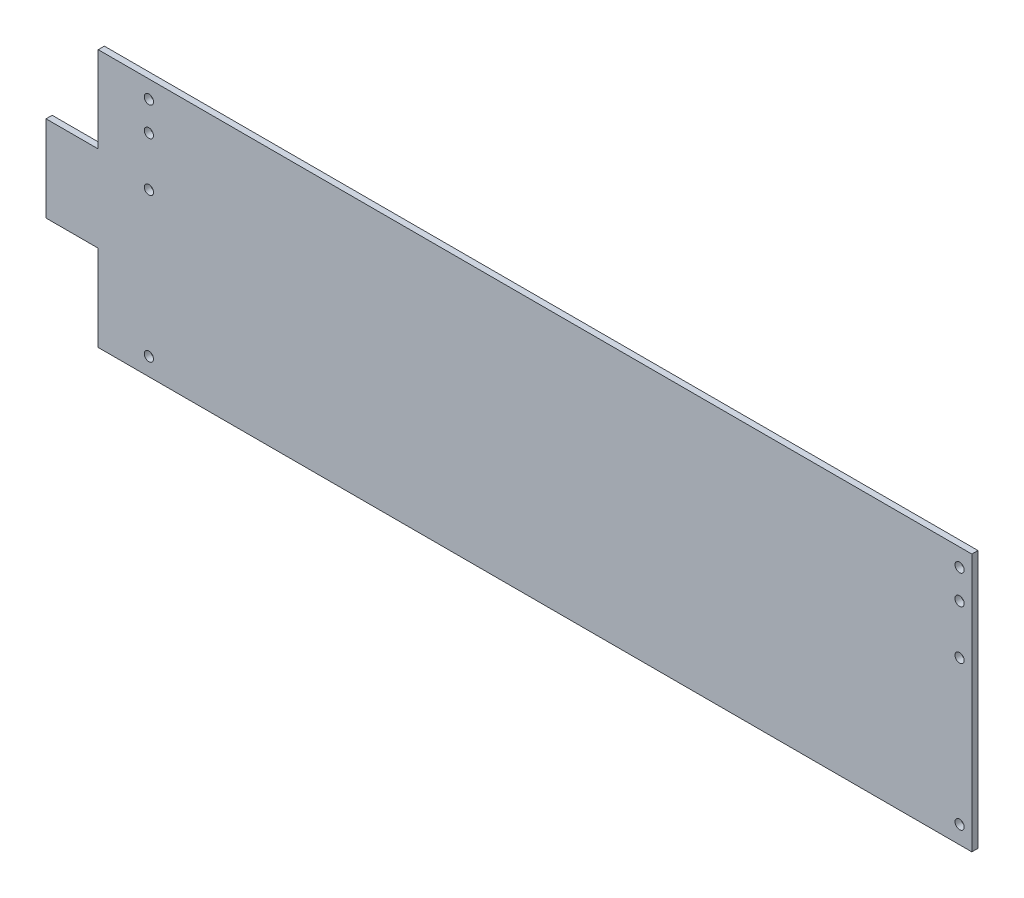
ISO-10303-21;
HEADER;
FILE_DESCRIPTION(('STEP AP214'),'2;1');
FILE_NAME('part.step','',(''),(''),'','','');
FILE_SCHEMA(('AUTOMOTIVE_DESIGN { 1 0 10303 214 1 1 1 1 }'));
ENDSEC;
DATA;
#1=APPLICATION_CONTEXT('core data for automotive mechanical design processes');
#2=APPLICATION_PROTOCOL_DEFINITION('international standard','automotive_design',2000,#1);
#3=PRODUCT_CONTEXT('',#1,'mechanical');
#4=PRODUCT('Part','Part','',(#3));
#5=PRODUCT_RELATED_PRODUCT_CATEGORY('part','',(#4));
#6=PRODUCT_DEFINITION_FORMATION('','',#4);
#7=PRODUCT_DEFINITION_CONTEXT('part definition',#1,'design');
#8=PRODUCT_DEFINITION('design','',#6,#7);
#9=PRODUCT_DEFINITION_SHAPE('','',#8);
#10=(LENGTH_UNIT() NAMED_UNIT(*) SI_UNIT(.MILLI.,.METRE.));
#11=(NAMED_UNIT(*) PLANE_ANGLE_UNIT() SI_UNIT($,.RADIAN.));
#12=(NAMED_UNIT(*) SI_UNIT($,.STERADIAN.) SOLID_ANGLE_UNIT());
#13=UNCERTAINTY_MEASURE_WITH_UNIT(LENGTH_MEASURE(1.E-05),#10,'distance_accuracy_value','');
#14=(GEOMETRIC_REPRESENTATION_CONTEXT(3) GLOBAL_UNCERTAINTY_ASSIGNED_CONTEXT((#13)) GLOBAL_UNIT_ASSIGNED_CONTEXT((#10,
#11,#12)) REPRESENTATION_CONTEXT('',''));
#15=CARTESIAN_POINT('',(0.,0.,0.));
#16=DIRECTION('',(0.,0.,1.));
#17=DIRECTION('',(1.,0.,0.));
#18=AXIS2_PLACEMENT_3D('',#15,#16,#17);
#19=CARTESIAN_POINT('',(0.,-42.,2.));
#20=DIRECTION('',(0.,1.,0.));
#21=DIRECTION('',(0.,0.,1.));
#22=AXIS2_PLACEMENT_3D('',#19,#20,#21);
#23=PLANE('',#22);
#24=DIRECTION('',(1.,0.,0.));
#25=VECTOR('',#24,1.);
#26=CARTESIAN_POINT('',(0.,-42.,0.));
#27=LINE('',#26,#25);
#28=CARTESIAN_POINT('',(-148.5,-42.,0.));
#29=VERTEX_POINT('',#28);
#30=CARTESIAN_POINT('',(136.,-42.,0.));
#31=VERTEX_POINT('',#30);
#32=EDGE_CURVE('E159',#29,#31,#27,.T.);
#33=ORIENTED_EDGE('',*,*,#32,.T.);
#34=DIRECTION('',(0.,0.,-1.));
#35=VECTOR('',#34,1.);
#36=CARTESIAN_POINT('',(136.,-42.,2.));
#37=LINE('',#36,#35);
#38=CARTESIAN_POINT('',(136.,-42.,2.));
#39=VERTEX_POINT('',#38);
#40=EDGE_CURVE('E11',#39,#31,#37,.T.);
#41=ORIENTED_EDGE('',*,*,#40,.F.);
#42=DIRECTION('',(1.,0.,0.));
#43=VECTOR('',#42,1.);
#44=CARTESIAN_POINT('',(0.,-42.,2.));
#45=LINE('',#44,#43);
#46=CARTESIAN_POINT('',(-148.5,-42.,2.));
#47=VERTEX_POINT('',#46);
#48=EDGE_CURVE('E212',#47,#39,#45,.T.);
#49=ORIENTED_EDGE('',*,*,#48,.F.);
#50=DIRECTION('',(0.,0.,-1.));
#51=VECTOR('',#50,1.);
#52=CARTESIAN_POINT('',(-148.5,-42.,2.));
#53=LINE('',#52,#51);
#54=EDGE_CURVE('E140',#47,#29,#53,.T.);
#55=ORIENTED_EDGE('',*,*,#54,.T.);
#56=EDGE_LOOP('',(#33,#41,#49,#55));
#57=FACE_BOUND('',#56,.T.);
#58=ADVANCED_FACE('F37',(#57),#23,.F.);
#59=CARTESIAN_POINT('',(136.,0.,2.));
#60=DIRECTION('',(-1.,0.,0.));
#61=DIRECTION('',(0.,0.,1.));
#62=AXIS2_PLACEMENT_3D('',#59,#60,#61);
#63=PLANE('',#62);
#64=DIRECTION('',(0.,1.,0.));
#65=VECTOR('',#64,1.);
#66=CARTESIAN_POINT('',(136.,0.,0.));
#67=LINE('',#66,#65);
#68=CARTESIAN_POINT('',(136.,42.,0.));
#69=VERTEX_POINT('',#68);
#70=EDGE_CURVE('E162',#31,#69,#67,.T.);
#71=ORIENTED_EDGE('',*,*,#70,.T.);
#72=DIRECTION('',(0.,0.,-1.));
#73=VECTOR('',#72,1.);
#74=CARTESIAN_POINT('',(136.,42.,2.));
#75=LINE('',#74,#73);
#76=CARTESIAN_POINT('',(136.,42.,2.));
#77=VERTEX_POINT('',#76);
#78=EDGE_CURVE('E46',#77,#69,#75,.T.);
#79=ORIENTED_EDGE('',*,*,#78,.F.);
#80=DIRECTION('',(0.,1.,0.));
#81=VECTOR('',#80,1.);
#82=CARTESIAN_POINT('',(136.,0.,2.));
#83=LINE('',#82,#81);
#84=EDGE_CURVE('E93',#39,#77,#83,.T.);
#85=ORIENTED_EDGE('',*,*,#84,.F.);
#86=ORIENTED_EDGE('',*,*,#40,.T.);
#87=EDGE_LOOP('',(#71,#79,#85,#86));
#88=FACE_BOUND('',#87,.T.);
#89=ADVANCED_FACE('F195',(#88),#63,.F.);
#90=CARTESIAN_POINT('',(0.,42.,2.));
#91=DIRECTION('',(0.,1.,0.));
#92=DIRECTION('',(0.,0.,1.));
#93=AXIS2_PLACEMENT_3D('',#90,#91,#92);
#94=PLANE('',#93);
#95=DIRECTION('',(1.,0.,0.));
#96=VECTOR('',#95,1.);
#97=CARTESIAN_POINT('',(0.,42.,0.));
#98=LINE('',#97,#96);
#99=CARTESIAN_POINT('',(-148.5,42.,0.));
#100=VERTEX_POINT('',#99);
#101=EDGE_CURVE('E165',#100,#69,#98,.T.);
#102=ORIENTED_EDGE('',*,*,#101,.F.);
#103=DIRECTION('',(0.,0.,-1.));
#104=VECTOR('',#103,1.);
#105=CARTESIAN_POINT('',(-148.5,42.,2.));
#106=LINE('',#105,#104);
#107=CARTESIAN_POINT('',(-148.5,42.,2.));
#108=VERTEX_POINT('',#107);
#109=EDGE_CURVE('E188',#108,#100,#106,.T.);
#110=ORIENTED_EDGE('',*,*,#109,.F.);
#111=DIRECTION('',(1.,0.,0.));
#112=VECTOR('',#111,1.);
#113=CARTESIAN_POINT('',(0.,42.,2.));
#114=LINE('',#113,#112);
#115=EDGE_CURVE('E194',#108,#77,#114,.T.);
#116=ORIENTED_EDGE('',*,*,#115,.T.);
#117=ORIENTED_EDGE('',*,*,#78,.T.);
#118=EDGE_LOOP('',(#102,#110,#116,#117));
#119=FACE_BOUND('',#118,.T.);
#120=ADVANCED_FACE('F192',(#119),#94,.T.);
#121=CARTESIAN_POINT('',(-148.5,0.,2.));
#122=DIRECTION('',(1.,0.,0.));
#123=DIRECTION('',(0.,0.,-1.));
#124=AXIS2_PLACEMENT_3D('',#121,#122,#123);
#125=PLANE('',#124);
#126=DIRECTION('',(0.,-1.,0.));
#127=VECTOR('',#126,1.);
#128=CARTESIAN_POINT('',(-148.5,0.,0.));
#129=LINE('',#128,#127);
#130=CARTESIAN_POINT('',(-148.5,14.,0.));
#131=VERTEX_POINT('',#130);
#132=EDGE_CURVE('E168',#100,#131,#129,.T.);
#133=ORIENTED_EDGE('',*,*,#132,.T.);
#134=DIRECTION('',(0.,0.,-1.));
#135=VECTOR('',#134,1.);
#136=CARTESIAN_POINT('',(-148.5,14.,2.));
#137=LINE('',#136,#135);
#138=CARTESIAN_POINT('',(-148.5,14.,2.));
#139=VERTEX_POINT('',#138);
#140=EDGE_CURVE('E185',#139,#131,#137,.T.);
#141=ORIENTED_EDGE('',*,*,#140,.F.);
#142=DIRECTION('',(0.,-1.,0.));
#143=VECTOR('',#142,1.);
#144=CARTESIAN_POINT('',(-148.5,0.,2.));
#145=LINE('',#144,#143);
#146=EDGE_CURVE('E132',#108,#139,#145,.T.);
#147=ORIENTED_EDGE('',*,*,#146,.F.);
#148=ORIENTED_EDGE('',*,*,#109,.T.);
#149=EDGE_LOOP('',(#133,#141,#147,#148));
#150=FACE_BOUND('',#149,.T.);
#151=ADVANCED_FACE('F205',(#150),#125,.F.);
#152=CARTESIAN_POINT('',(0.,14.,2.));
#153=DIRECTION('',(0.,-1.,0.));
#154=DIRECTION('',(1.,0.,0.));
#155=AXIS2_PLACEMENT_3D('',#152,#153,#154);
#156=PLANE('',#155);
#157=DIRECTION('',(-1.,0.,0.));
#158=VECTOR('',#157,1.);
#159=CARTESIAN_POINT('',(0.,14.,0.));
#160=LINE('',#159,#158);
#161=CARTESIAN_POINT('',(-165.5,14.,0.));
#162=VERTEX_POINT('',#161);
#163=EDGE_CURVE('E170',#131,#162,#160,.T.);
#164=ORIENTED_EDGE('',*,*,#163,.T.);
#165=DIRECTION('',(0.,0.,-1.));
#166=VECTOR('',#165,1.);
#167=CARTESIAN_POINT('',(-165.5,14.,2.));
#168=LINE('',#167,#166);
#169=CARTESIAN_POINT('',(-165.5,14.,2.));
#170=VERTEX_POINT('',#169);
#171=EDGE_CURVE('E126',#170,#162,#168,.T.);
#172=ORIENTED_EDGE('',*,*,#171,.F.);
#173=DIRECTION('',(-1.,0.,0.));
#174=VECTOR('',#173,1.);
#175=CARTESIAN_POINT('',(0.,14.,2.));
#176=LINE('',#175,#174);
#177=EDGE_CURVE('E113',#139,#170,#176,.T.);
#178=ORIENTED_EDGE('',*,*,#177,.F.);
#179=ORIENTED_EDGE('',*,*,#140,.T.);
#180=EDGE_LOOP('',(#164,#172,#178,#179));
#181=FACE_BOUND('',#180,.T.);
#182=ADVANCED_FACE('F208',(#181),#156,.F.);
#183=CARTESIAN_POINT('',(-165.5,0.,2.));
#184=DIRECTION('',(1.,0.,0.));
#185=DIRECTION('',(0.,0.,-1.));
#186=AXIS2_PLACEMENT_3D('',#183,#184,#185);
#187=PLANE('',#186);
#188=DIRECTION('',(0.,-1.,0.));
#189=VECTOR('',#188,1.);
#190=CARTESIAN_POINT('',(-165.5,0.,0.));
#191=LINE('',#190,#189);
#192=CARTESIAN_POINT('',(-165.5,-14.,0.));
#193=VERTEX_POINT('',#192);
#194=EDGE_CURVE('E122',#162,#193,#191,.T.);
#195=ORIENTED_EDGE('',*,*,#194,.T.);
#196=DIRECTION('',(0.,0.,-1.));
#197=VECTOR('',#196,1.);
#198=CARTESIAN_POINT('',(-165.5,-14.,2.));
#199=LINE('',#198,#197);
#200=CARTESIAN_POINT('',(-165.5,-14.,2.));
#201=VERTEX_POINT('',#200);
#202=EDGE_CURVE('E119',#201,#193,#199,.T.);
#203=ORIENTED_EDGE('',*,*,#202,.F.);
#204=DIRECTION('',(0.,-1.,0.));
#205=VECTOR('',#204,1.);
#206=CARTESIAN_POINT('',(-165.5,0.,2.));
#207=LINE('',#206,#205);
#208=EDGE_CURVE('E106',#170,#201,#207,.T.);
#209=ORIENTED_EDGE('',*,*,#208,.F.);
#210=ORIENTED_EDGE('',*,*,#171,.T.);
#211=EDGE_LOOP('',(#195,#203,#209,#210));
#212=FACE_BOUND('',#211,.T.);
#213=ADVANCED_FACE('F120',(#212),#187,.F.);
#214=CARTESIAN_POINT('',(0.,-14.,2.));
#215=DIRECTION('',(0.,-1.,0.));
#216=DIRECTION('',(1.,0.,0.));
#217=AXIS2_PLACEMENT_3D('',#214,#215,#216);
#218=PLANE('',#217);
#219=DIRECTION('',(-1.,0.,0.));
#220=VECTOR('',#219,1.);
#221=CARTESIAN_POINT('',(0.,-14.,0.));
#222=LINE('',#221,#220);
#223=CARTESIAN_POINT('',(-148.5,-14.,0.));
#224=VERTEX_POINT('',#223);
#225=EDGE_CURVE('E173',#224,#193,#222,.T.);
#226=ORIENTED_EDGE('',*,*,#225,.F.);
#227=DIRECTION('',(0.,0.,-1.));
#228=VECTOR('',#227,1.);
#229=CARTESIAN_POINT('',(-148.5,-14.,2.));
#230=LINE('',#229,#228);
#231=CARTESIAN_POINT('',(-148.5,-14.,2.));
#232=VERTEX_POINT('',#231);
#233=EDGE_CURVE('E82',#232,#224,#230,.T.);
#234=ORIENTED_EDGE('',*,*,#233,.F.);
#235=DIRECTION('',(-1.,0.,0.));
#236=VECTOR('',#235,1.);
#237=CARTESIAN_POINT('',(0.,-14.,2.));
#238=LINE('',#237,#236);
#239=EDGE_CURVE('E111',#232,#201,#238,.T.);
#240=ORIENTED_EDGE('',*,*,#239,.T.);
#241=ORIENTED_EDGE('',*,*,#202,.T.);
#242=EDGE_LOOP('',(#226,#234,#240,#241));
#243=FACE_BOUND('',#242,.T.);
#244=ADVANCED_FACE('F128',(#243),#218,.T.);
#245=CARTESIAN_POINT('',(-132.,10.75,2.));
#246=DIRECTION('',(0.,0.,-1.));
#247=DIRECTION('',(-1.,0.,0.));
#248=AXIS2_PLACEMENT_3D('',#245,#246,#247);
#249=CYLINDRICAL_SURFACE('',#248,1.5);
#250=CARTESIAN_POINT('',(-132.,10.75,2.));
#251=DIRECTION('',(0.,0.,1.));
#252=DIRECTION('',(1.,0.,0.));
#253=AXIS2_PLACEMENT_3D('',#250,#251,#252);
#254=CIRCLE('',#253,1.5);
#255=CARTESIAN_POINT('',(-130.5,10.75,2.));
#256=VERTEX_POINT('',#255);
#257=EDGE_CURVE('E130',#256,#256,#254,.F.);
#258=ORIENTED_EDGE('',*,*,#257,.F.);
#259=EDGE_LOOP('',(#258));
#260=FACE_BOUND('',#259,.T.);
#261=CARTESIAN_POINT('',(-132.,10.75,0.));
#262=DIRECTION('',(0.,0.,1.));
#263=DIRECTION('',(1.,0.,0.));
#264=AXIS2_PLACEMENT_3D('',#261,#262,#263);
#265=CIRCLE('',#264,1.5);
#266=CARTESIAN_POINT('',(-130.5,10.75,0.));
#267=VERTEX_POINT('',#266);
#268=EDGE_CURVE('E175',#267,#267,#265,.F.);
#269=ORIENTED_EDGE('',*,*,#268,.T.);
#270=EDGE_LOOP('',(#269));
#271=FACE_BOUND('',#270,.T.);
#272=ADVANCED_FACE('F266',(#260,#271),#249,.F.);
#273=EDGE_CURVE('E85',#224,#29,#129,.T.);
#274=ORIENTED_EDGE('',*,*,#273,.T.);
#275=ORIENTED_EDGE('',*,*,#54,.F.);
#276=EDGE_CURVE('E54',#232,#47,#145,.T.);
#277=ORIENTED_EDGE('',*,*,#276,.F.);
#278=ORIENTED_EDGE('',*,*,#233,.T.);
#279=EDGE_LOOP('',(#274,#275,#277,#278));
#280=FACE_BOUND('',#279,.T.);
#281=ADVANCED_FACE('F256',(#280),#125,.F.);
#282=CARTESIAN_POINT('',(132.,36.25,2.));
#283=DIRECTION('',(0.,0.,-1.));
#284=DIRECTION('',(-1.,0.,0.));
#285=AXIS2_PLACEMENT_3D('',#282,#283,#284);
#286=CYLINDRICAL_SURFACE('',#285,1.5);
#287=CARTESIAN_POINT('',(132.,36.25,2.));
#288=DIRECTION('',(0.,0.,1.));
#289=DIRECTION('',(1.,0.,0.));
#290=AXIS2_PLACEMENT_3D('',#287,#288,#289);
#291=CIRCLE('',#290,1.5);
#292=CARTESIAN_POINT('',(133.5,36.25,2.));
#293=VERTEX_POINT('',#292);
#294=EDGE_CURVE('E214',#293,#293,#291,.T.);
#295=ORIENTED_EDGE('',*,*,#294,.T.);
#296=EDGE_LOOP('',(#295));
#297=FACE_BOUND('',#296,.T.);
#298=CARTESIAN_POINT('',(132.,36.25,0.));
#299=DIRECTION('',(0.,0.,1.));
#300=DIRECTION('',(1.,0.,0.));
#301=AXIS2_PLACEMENT_3D('',#298,#299,#300);
#302=CIRCLE('',#301,1.5);
#303=CARTESIAN_POINT('',(133.5,36.25,0.));
#304=VERTEX_POINT('',#303);
#305=EDGE_CURVE('E156',#304,#304,#302,.T.);
#306=ORIENTED_EDGE('',*,*,#305,.F.);
#307=EDGE_LOOP('',(#306));
#308=FACE_BOUND('',#307,.T.);
#309=ADVANCED_FACE('F253',(#297,#308),#286,.F.);
#310=CARTESIAN_POINT('',(132.,26.75,2.));
#311=DIRECTION('',(0.,0.,-1.));
#312=DIRECTION('',(-1.,0.,0.));
#313=AXIS2_PLACEMENT_3D('',#310,#311,#312);
#314=CYLINDRICAL_SURFACE('',#313,1.5);
#315=CARTESIAN_POINT('',(132.,26.75,2.));
#316=DIRECTION('',(0.,0.,1.));
#317=DIRECTION('',(1.,0.,0.));
#318=AXIS2_PLACEMENT_3D('',#315,#316,#317);
#319=CIRCLE('',#318,1.5);
#320=CARTESIAN_POINT('',(133.5,26.75,2.));
#321=VERTEX_POINT('',#320);
#322=EDGE_CURVE('E217',#321,#321,#319,.T.);
#323=ORIENTED_EDGE('',*,*,#322,.T.);
#324=EDGE_LOOP('',(#323));
#325=FACE_BOUND('',#324,.T.);
#326=CARTESIAN_POINT('',(132.,26.75,0.));
#327=DIRECTION('',(0.,0.,1.));
#328=DIRECTION('',(1.,0.,0.));
#329=AXIS2_PLACEMENT_3D('',#326,#327,#328);
#330=CIRCLE('',#329,1.5);
#331=CARTESIAN_POINT('',(133.5,26.75,0.));
#332=VERTEX_POINT('',#331);
#333=EDGE_CURVE('E153',#332,#332,#330,.T.);
#334=ORIENTED_EDGE('',*,*,#333,.F.);
#335=EDGE_LOOP('',(#334));
#336=FACE_BOUND('',#335,.T.);
#337=ADVANCED_FACE('F255',(#325,#336),#314,.F.);
#338=CARTESIAN_POINT('',(132.,10.75,2.));
#339=DIRECTION('',(0.,0.,-1.));
#340=DIRECTION('',(-1.,0.,0.));
#341=AXIS2_PLACEMENT_3D('',#338,#339,#340);
#342=CYLINDRICAL_SURFACE('',#341,1.5);
#343=CARTESIAN_POINT('',(132.,10.75,2.));
#344=DIRECTION('',(0.,0.,1.));
#345=DIRECTION('',(1.,0.,0.));
#346=AXIS2_PLACEMENT_3D('',#343,#344,#345);
#347=CIRCLE('',#346,1.5);
#348=CARTESIAN_POINT('',(133.5,10.75,2.));
#349=VERTEX_POINT('',#348);
#350=EDGE_CURVE('E220',#349,#349,#347,.T.);
#351=ORIENTED_EDGE('',*,*,#350,.T.);
#352=EDGE_LOOP('',(#351));
#353=FACE_BOUND('',#352,.T.);
#354=CARTESIAN_POINT('',(132.,10.75,0.));
#355=DIRECTION('',(0.,0.,1.));
#356=DIRECTION('',(1.,0.,0.));
#357=AXIS2_PLACEMENT_3D('',#354,#355,#356);
#358=CIRCLE('',#357,1.5);
#359=CARTESIAN_POINT('',(133.5,10.75,0.));
#360=VERTEX_POINT('',#359);
#361=EDGE_CURVE('E150',#360,#360,#358,.T.);
#362=ORIENTED_EDGE('',*,*,#361,.F.);
#363=EDGE_LOOP('',(#362));
#364=FACE_BOUND('',#363,.T.);
#365=ADVANCED_FACE('F263',(#353,#364),#342,.F.);
#366=CARTESIAN_POINT('',(132.,-36.25,2.));
#367=DIRECTION('',(0.,0.,-1.));
#368=DIRECTION('',(-1.,0.,0.));
#369=AXIS2_PLACEMENT_3D('',#366,#367,#368);
#370=CYLINDRICAL_SURFACE('',#369,1.5);
#371=CARTESIAN_POINT('',(132.,-36.25,2.));
#372=DIRECTION('',(0.,0.,1.));
#373=DIRECTION('',(1.,0.,0.));
#374=AXIS2_PLACEMENT_3D('',#371,#372,#373);
#375=CIRCLE('',#374,1.5);
#376=CARTESIAN_POINT('',(133.5,-36.25,2.));
#377=VERTEX_POINT('',#376);
#378=EDGE_CURVE('E223',#377,#377,#375,.T.);
#379=ORIENTED_EDGE('',*,*,#378,.T.);
#380=EDGE_LOOP('',(#379));
#381=FACE_BOUND('',#380,.T.);
#382=CARTESIAN_POINT('',(132.,-36.25,0.));
#383=DIRECTION('',(0.,0.,1.));
#384=DIRECTION('',(1.,0.,0.));
#385=AXIS2_PLACEMENT_3D('',#382,#383,#384);
#386=CIRCLE('',#385,1.5);
#387=CARTESIAN_POINT('',(133.5,-36.25,0.));
#388=VERTEX_POINT('',#387);
#389=EDGE_CURVE('E147',#388,#388,#386,.T.);
#390=ORIENTED_EDGE('',*,*,#389,.F.);
#391=EDGE_LOOP('',(#390));
#392=FACE_BOUND('',#391,.T.);
#393=ADVANCED_FACE('F332',(#381,#392),#370,.F.);
#394=CARTESIAN_POINT('',(-132.,-36.25,2.));
#395=DIRECTION('',(0.,0.,-1.));
#396=DIRECTION('',(-1.,0.,0.));
#397=AXIS2_PLACEMENT_3D('',#394,#395,#396);
#398=CYLINDRICAL_SURFACE('',#397,1.5);
#399=CARTESIAN_POINT('',(-132.,-36.25,2.));
#400=DIRECTION('',(0.,0.,1.));
#401=DIRECTION('',(1.,0.,0.));
#402=AXIS2_PLACEMENT_3D('',#399,#400,#401);
#403=CIRCLE('',#402,1.5);
#404=CARTESIAN_POINT('',(-130.5,-36.25,2.));
#405=VERTEX_POINT('',#404);
#406=EDGE_CURVE('E226',#405,#405,#403,.F.);
#407=ORIENTED_EDGE('',*,*,#406,.F.);
#408=EDGE_LOOP('',(#407));
#409=FACE_BOUND('',#408,.T.);
#410=CARTESIAN_POINT('',(-132.,-36.25,0.));
#411=DIRECTION('',(0.,0.,1.));
#412=DIRECTION('',(1.,0.,0.));
#413=AXIS2_PLACEMENT_3D('',#410,#411,#412);
#414=CIRCLE('',#413,1.5);
#415=CARTESIAN_POINT('',(-130.5,-36.25,0.));
#416=VERTEX_POINT('',#415);
#417=EDGE_CURVE('E144',#416,#416,#414,.F.);
#418=ORIENTED_EDGE('',*,*,#417,.T.);
#419=EDGE_LOOP('',(#418));
#420=FACE_BOUND('',#419,.T.);
#421=ADVANCED_FACE('F237',(#409,#420),#398,.F.);
#422=CARTESIAN_POINT('',(-132.,26.75,2.));
#423=DIRECTION('',(0.,0.,-1.));
#424=DIRECTION('',(-1.,0.,0.));
#425=AXIS2_PLACEMENT_3D('',#422,#423,#424);
#426=CYLINDRICAL_SURFACE('',#425,1.5);
#427=CARTESIAN_POINT('',(-132.,26.75,2.));
#428=DIRECTION('',(0.,0.,1.));
#429=DIRECTION('',(1.,0.,0.));
#430=AXIS2_PLACEMENT_3D('',#427,#428,#429);
#431=CIRCLE('',#430,1.5);
#432=CARTESIAN_POINT('',(-130.5,26.75,2.));
#433=VERTEX_POINT('',#432);
#434=EDGE_CURVE('E181',#433,#433,#431,.F.);
#435=ORIENTED_EDGE('',*,*,#434,.F.);
#436=EDGE_LOOP('',(#435));
#437=FACE_BOUND('',#436,.T.);
#438=CARTESIAN_POINT('',(-132.,26.75,0.));
#439=DIRECTION('',(0.,0.,1.));
#440=DIRECTION('',(1.,0.,0.));
#441=AXIS2_PLACEMENT_3D('',#438,#439,#440);
#442=CIRCLE('',#441,1.5);
#443=CARTESIAN_POINT('',(-130.5,26.75,0.));
#444=VERTEX_POINT('',#443);
#445=EDGE_CURVE('E141',#444,#444,#442,.F.);
#446=ORIENTED_EDGE('',*,*,#445,.T.);
#447=EDGE_LOOP('',(#446));
#448=FACE_BOUND('',#447,.T.);
#449=ADVANCED_FACE('F39',(#437,#448),#426,.F.);
#450=CARTESIAN_POINT('',(-132.,36.25,2.));
#451=DIRECTION('',(0.,0.,-1.));
#452=DIRECTION('',(-1.,0.,0.));
#453=AXIS2_PLACEMENT_3D('',#450,#451,#452);
#454=CYLINDRICAL_SURFACE('',#453,1.5);
#455=CARTESIAN_POINT('',(-132.,36.25,2.));
#456=DIRECTION('',(0.,0.,1.));
#457=DIRECTION('',(1.,0.,0.));
#458=AXIS2_PLACEMENT_3D('',#455,#456,#457);
#459=CIRCLE('',#458,1.5);
#460=CARTESIAN_POINT('',(-130.5,36.25,2.));
#461=VERTEX_POINT('',#460);
#462=EDGE_CURVE('E137',#461,#461,#459,.F.);
#463=ORIENTED_EDGE('',*,*,#462,.F.);
#464=EDGE_LOOP('',(#463));
#465=FACE_BOUND('',#464,.T.);
#466=CARTESIAN_POINT('',(-132.,36.25,0.));
#467=DIRECTION('',(0.,0.,1.));
#468=DIRECTION('',(1.,0.,0.));
#469=AXIS2_PLACEMENT_3D('',#466,#467,#468);
#470=CIRCLE('',#469,1.5);
#471=CARTESIAN_POINT('',(-130.5,36.25,0.));
#472=VERTEX_POINT('',#471);
#473=EDGE_CURVE('E178',#472,#472,#470,.F.);
#474=ORIENTED_EDGE('',*,*,#473,.T.);
#475=EDGE_LOOP('',(#474));
#476=FACE_BOUND('',#475,.T.);
#477=ADVANCED_FACE('F236',(#465,#476),#454,.F.);
#478=CARTESIAN_POINT('',(0.,0.,2.));
#479=DIRECTION('',(0.,0.,1.));
#480=DIRECTION('',(1.,0.,0.));
#481=AXIS2_PLACEMENT_3D('',#478,#479,#480);
#482=PLANE('',#481);
#483=ORIENTED_EDGE('',*,*,#434,.T.);
#484=EDGE_LOOP('',(#483));
#485=FACE_BOUND('',#484,.T.);
#486=ORIENTED_EDGE('',*,*,#406,.T.);
#487=EDGE_LOOP('',(#486));
#488=FACE_BOUND('',#487,.T.);
#489=ORIENTED_EDGE('',*,*,#378,.F.);
#490=EDGE_LOOP('',(#489));
#491=FACE_BOUND('',#490,.T.);
#492=ORIENTED_EDGE('',*,*,#350,.F.);
#493=EDGE_LOOP('',(#492));
#494=FACE_BOUND('',#493,.T.);
#495=ORIENTED_EDGE('',*,*,#322,.F.);
#496=EDGE_LOOP('',(#495));
#497=FACE_BOUND('',#496,.T.);
#498=ORIENTED_EDGE('',*,*,#294,.F.);
#499=EDGE_LOOP('',(#498));
#500=FACE_BOUND('',#499,.T.);
#501=ORIENTED_EDGE('',*,*,#48,.T.);
#502=ORIENTED_EDGE('',*,*,#84,.T.);
#503=ORIENTED_EDGE('',*,*,#115,.F.);
#504=ORIENTED_EDGE('',*,*,#146,.T.);
#505=ORIENTED_EDGE('',*,*,#177,.T.);
#506=ORIENTED_EDGE('',*,*,#208,.T.);
#507=ORIENTED_EDGE('',*,*,#239,.F.);
#508=ORIENTED_EDGE('',*,*,#276,.T.);
#509=EDGE_LOOP('',(#501,#502,#503,#504,#505,#506,#507,#508));
#510=FACE_BOUND('',#509,.T.);
#511=ORIENTED_EDGE('',*,*,#257,.T.);
#512=EDGE_LOOP('',(#511));
#513=FACE_BOUND('',#512,.T.);
#514=ORIENTED_EDGE('',*,*,#462,.T.);
#515=EDGE_LOOP('',(#514));
#516=FACE_BOUND('',#515,.T.);
#517=ADVANCED_FACE('F108',(#485,#488,#491,#494,#497,#500,#510,#513,#516),#482,.T.);
#518=CARTESIAN_POINT('',(0.,0.,0.));
#519=DIRECTION('',(0.,0.,1.));
#520=DIRECTION('',(1.,0.,0.));
#521=AXIS2_PLACEMENT_3D('',#518,#519,#520);
#522=PLANE('',#521);
#523=ORIENTED_EDGE('',*,*,#445,.F.);
#524=EDGE_LOOP('',(#523));
#525=FACE_BOUND('',#524,.T.);
#526=ORIENTED_EDGE('',*,*,#417,.F.);
#527=EDGE_LOOP('',(#526));
#528=FACE_BOUND('',#527,.T.);
#529=ORIENTED_EDGE('',*,*,#389,.T.);
#530=EDGE_LOOP('',(#529));
#531=FACE_BOUND('',#530,.T.);
#532=ORIENTED_EDGE('',*,*,#361,.T.);
#533=EDGE_LOOP('',(#532));
#534=FACE_BOUND('',#533,.T.);
#535=ORIENTED_EDGE('',*,*,#333,.T.);
#536=EDGE_LOOP('',(#535));
#537=FACE_BOUND('',#536,.T.);
#538=ORIENTED_EDGE('',*,*,#305,.T.);
#539=EDGE_LOOP('',(#538));
#540=FACE_BOUND('',#539,.T.);
#541=ORIENTED_EDGE('',*,*,#32,.F.);
#542=ORIENTED_EDGE('',*,*,#273,.F.);
#543=ORIENTED_EDGE('',*,*,#225,.T.);
#544=ORIENTED_EDGE('',*,*,#194,.F.);
#545=ORIENTED_EDGE('',*,*,#163,.F.);
#546=ORIENTED_EDGE('',*,*,#132,.F.);
#547=ORIENTED_EDGE('',*,*,#101,.T.);
#548=ORIENTED_EDGE('',*,*,#70,.F.);
#549=EDGE_LOOP('',(#541,#542,#543,#544,#545,#546,#547,#548));
#550=FACE_BOUND('',#549,.T.);
#551=ORIENTED_EDGE('',*,*,#268,.F.);
#552=EDGE_LOOP('',(#551));
#553=FACE_BOUND('',#552,.T.);
#554=ORIENTED_EDGE('',*,*,#473,.F.);
#555=EDGE_LOOP('',(#554));
#556=FACE_BOUND('',#555,.T.);
#557=ADVANCED_FACE('F200',(#525,#528,#531,#534,#537,#540,#550,#553,#556),#522,.F.);
#558=CLOSED_SHELL('',(#58,#89,#120,#151,#182,#213,#244,#272,#281,#309,#337,#365,#393,#421,#449,
#477,#517,#557));
#559=MANIFOLD_SOLID_BREP('B2',#558);
#560=ADVANCED_BREP_SHAPE_REPRESENTATION('',(#18,#559),#14);
#561=SHAPE_DEFINITION_REPRESENTATION(#9,#560);
ENDSEC;
END-ISO-10303-21;
